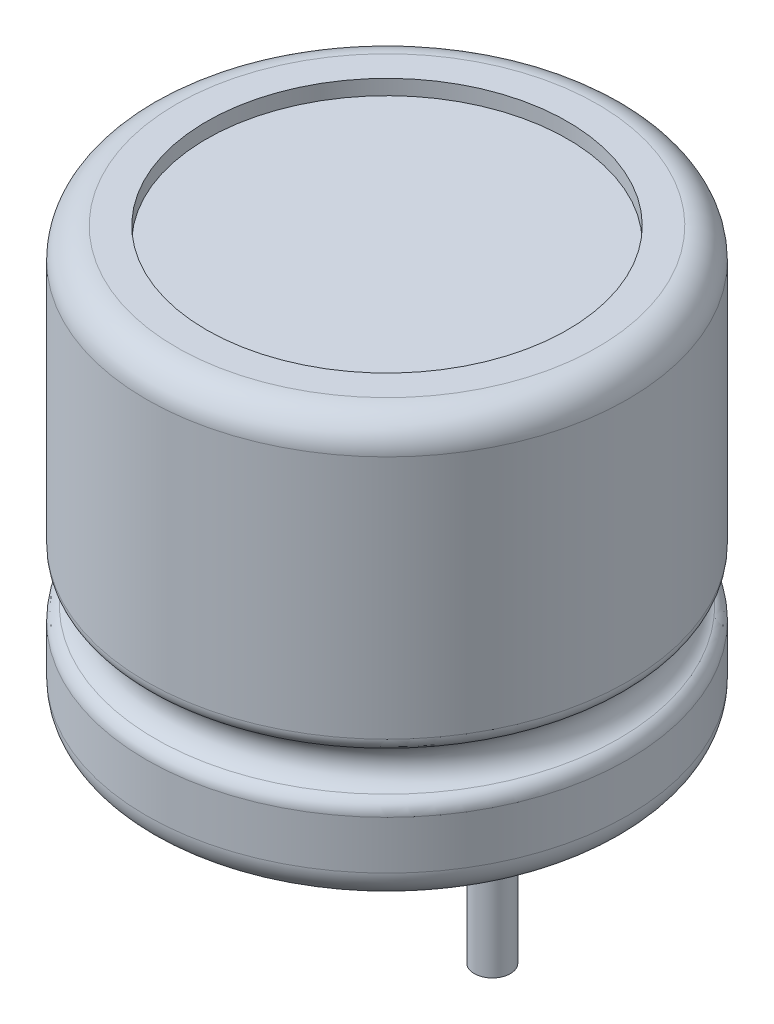
ISO-10303-21;
HEADER;
FILE_DESCRIPTION(('STEP AP214'),'2;1');
FILE_NAME('part.step','',(''),(''),'','','');
FILE_SCHEMA(('AUTOMOTIVE_DESIGN { 1 0 10303 214 1 1 1 1 }'));
ENDSEC;
DATA;
#1=APPLICATION_CONTEXT('core data for automotive mechanical design processes');
#2=APPLICATION_PROTOCOL_DEFINITION('international standard','automotive_design',2000,#1);
#3=PRODUCT_CONTEXT('',#1,'mechanical');
#4=PRODUCT('Part','Part','',(#3));
#5=PRODUCT_RELATED_PRODUCT_CATEGORY('part','',(#4));
#6=PRODUCT_DEFINITION_FORMATION('','',#4);
#7=PRODUCT_DEFINITION_CONTEXT('part definition',#1,'design');
#8=PRODUCT_DEFINITION('design','',#6,#7);
#9=PRODUCT_DEFINITION_SHAPE('','',#8);
#10=(LENGTH_UNIT() NAMED_UNIT(*) SI_UNIT(.MILLI.,.METRE.));
#11=(NAMED_UNIT(*) PLANE_ANGLE_UNIT() SI_UNIT($,.RADIAN.));
#12=(NAMED_UNIT(*) SI_UNIT($,.STERADIAN.) SOLID_ANGLE_UNIT());
#13=UNCERTAINTY_MEASURE_WITH_UNIT(LENGTH_MEASURE(1.E-05),#10,'distance_accuracy_value','');
#14=(GEOMETRIC_REPRESENTATION_CONTEXT(3) GLOBAL_UNCERTAINTY_ASSIGNED_CONTEXT((#13)) GLOBAL_UNIT_ASSIGNED_CONTEXT((#10,
#11,#12)) REPRESENTATION_CONTEXT('',''));
#15=CARTESIAN_POINT('',(0.,0.,0.));
#16=DIRECTION('',(0.,0.,1.));
#17=DIRECTION('',(1.,0.,0.));
#18=AXIS2_PLACEMENT_3D('',#15,#16,#17);
#19=CARTESIAN_POINT('',(0.,6.99057191956741,0.));
#20=DIRECTION('',(0.,-1.,0.));
#21=DIRECTION('',(1.,0.,0.));
#22=AXIS2_PLACEMENT_3D('',#19,#20,#21);
#23=CYLINDRICAL_SURFACE('',#22,4.);
#24=CARTESIAN_POINT('',(0.,6.49057191956741,0.));
#25=DIRECTION('',(0.,1.,0.));
#26=DIRECTION('',(-1.,0.,0.));
#27=AXIS2_PLACEMENT_3D('',#24,#25,#26);
#28=CIRCLE('',#27,4.);
#29=CARTESIAN_POINT('',(-4.,6.49057191956741,0.));
#30=VERTEX_POINT('',#29);
#31=EDGE_CURVE('E41',#30,#30,#28,.F.);
#32=ORIENTED_EDGE('',*,*,#31,.T.);
#33=EDGE_LOOP('',(#32));
#34=FACE_BOUND('',#33,.T.);
#35=CARTESIAN_POINT('',(0.,2.42749305001555,0.));
#36=DIRECTION('',(0.,1.,0.));
#37=DIRECTION('',(-1.,0.,0.));
#38=AXIS2_PLACEMENT_3D('',#35,#36,#37);
#39=CIRCLE('',#38,4.);
#40=CARTESIAN_POINT('',(-4.,2.42749305001555,0.));
#41=VERTEX_POINT('',#40);
#42=EDGE_CURVE('E57',#41,#41,#39,.T.);
#43=ORIENTED_EDGE('',*,*,#42,.T.);
#44=EDGE_LOOP('',(#43));
#45=FACE_BOUND('',#44,.T.);
#46=ADVANCED_FACE('F34',(#34,#45),#23,.T.);
#47=CARTESIAN_POINT('',(0.,1.86528595978371,0.));
#48=DIRECTION('',(0.,-1.,0.));
#49=DIRECTION('',(1.,0.,0.));
#50=AXIS2_PLACEMENT_3D('',#47,#48,#49);
#51=TOROIDAL_SURFACE('',#50,4.,0.365285959783707);
#52=CARTESIAN_POINT('',(0.,2.19905979825183,0.));
#53=DIRECTION('',(0.,-1.,0.));
#54=DIRECTION('',(1.,0.,0.));
#55=AXIS2_PLACEMENT_3D('',#52,#53,#54);
#56=CIRCLE('',#55,3.85157878463856);
#57=CARTESIAN_POINT('',(3.85157878463856,2.19905979825183,0.));
#58=VERTEX_POINT('',#57);
#59=EDGE_CURVE('E60',#58,#58,#56,.T.);
#60=ORIENTED_EDGE('',*,*,#59,.T.);
#61=EDGE_LOOP('',(#60));
#62=FACE_BOUND('',#61,.T.);
#63=CARTESIAN_POINT('',(0.,1.53151212131558,0.));
#64=DIRECTION('',(0.,1.,0.));
#65=DIRECTION('',(-1.,0.,0.));
#66=AXIS2_PLACEMENT_3D('',#63,#64,#65);
#67=CIRCLE('',#66,3.85157878463856);
#68=CARTESIAN_POINT('',(-3.85157878463856,1.53151212131558,0.));
#69=VERTEX_POINT('',#68);
#70=EDGE_CURVE('E63',#69,#69,#67,.T.);
#71=ORIENTED_EDGE('',*,*,#70,.T.);
#72=EDGE_LOOP('',(#71));
#73=FACE_BOUND('',#72,.T.);
#74=ADVANCED_FACE('F109',(#62,#73),#51,.F.);
#75=CARTESIAN_POINT('',(0.,6.99057191956741,0.));
#76=DIRECTION('',(0.,-1.,0.));
#77=DIRECTION('',(1.,0.,0.));
#78=AXIS2_PLACEMENT_3D('',#75,#76,#77);
#79=CYLINDRICAL_SURFACE('',#78,4.);
#80=CARTESIAN_POINT('',(0.,0.5,0.));
#81=DIRECTION('',(0.,-1.,0.));
#82=DIRECTION('',(1.,0.,0.));
#83=AXIS2_PLACEMENT_3D('',#80,#81,#82);
#84=CIRCLE('',#83,4.);
#85=CARTESIAN_POINT('',(4.,0.5,0.));
#86=VERTEX_POINT('',#85);
#87=EDGE_CURVE('E45',#86,#86,#84,.F.);
#88=ORIENTED_EDGE('',*,*,#87,.T.);
#89=EDGE_LOOP('',(#88));
#90=FACE_BOUND('',#89,.T.);
#91=CARTESIAN_POINT('',(0.,1.30307886955186,0.));
#92=DIRECTION('',(0.,1.,0.));
#93=DIRECTION('',(-1.,0.,0.));
#94=AXIS2_PLACEMENT_3D('',#91,#92,#93);
#95=CIRCLE('',#94,4.);
#96=CARTESIAN_POINT('',(-4.,1.30307886955186,0.));
#97=VERTEX_POINT('',#96);
#98=EDGE_CURVE('E54',#97,#97,#95,.F.);
#99=ORIENTED_EDGE('',*,*,#98,.T.);
#100=EDGE_LOOP('',(#99));
#101=FACE_BOUND('',#100,.T.);
#102=ADVANCED_FACE('F105',(#90,#101),#79,.T.);
#103=CARTESIAN_POINT('',(0.,0.,0.));
#104=DIRECTION('',(0.,-1.,0.));
#105=DIRECTION('',(1.,0.,0.));
#106=AXIS2_PLACEMENT_3D('',#103,#104,#105);
#107=PLANE('',#106);
#108=CARTESIAN_POINT('',(0.,0.,0.));
#109=DIRECTION('',(0.,-1.,0.));
#110=DIRECTION('',(1.,0.,0.));
#111=AXIS2_PLACEMENT_3D('',#108,#109,#110);
#112=CIRCLE('',#111,3.5);
#113=CARTESIAN_POINT('',(3.5,0.,0.));
#114=VERTEX_POINT('',#113);
#115=EDGE_CURVE('E49',#114,#114,#112,.T.);
#116=ORIENTED_EDGE('',*,*,#115,.T.);
#117=EDGE_LOOP('',(#116));
#118=FACE_BOUND('',#117,.T.);
#119=CARTESIAN_POINT('',(0.,0.,0.));
#120=DIRECTION('',(0.,-1.,0.));
#121=DIRECTION('',(0.,0.,-1.));
#122=AXIS2_PLACEMENT_3D('',#119,#120,#121);
#123=CIRCLE('',#122,2.99999999999999);
#124=CARTESIAN_POINT('',(0.,0.,-2.99999999999999));
#125=VERTEX_POINT('',#124);
#126=EDGE_CURVE('E69',#125,#125,#123,.T.);
#127=ORIENTED_EDGE('',*,*,#126,.F.);
#128=EDGE_LOOP('',(#127));
#129=FACE_BOUND('',#128,.T.);
#130=ADVANCED_FACE('F96',(#118,#129),#107,.T.);
#131=CARTESIAN_POINT('',(4.,6.99057191956741,0.));
#132=DIRECTION('',(0.,1.,0.));
#133=DIRECTION('',(-1.,0.,0.));
#134=AXIS2_PLACEMENT_3D('',#131,#132,#133);
#135=PLANE('',#134);
#136=CARTESIAN_POINT('',(0.,6.99057191956741,0.));
#137=DIRECTION('',(0.,1.,0.));
#138=DIRECTION('',(-1.,0.,0.));
#139=AXIS2_PLACEMENT_3D('',#136,#137,#138);
#140=CIRCLE('',#139,3.5);
#141=CARTESIAN_POINT('',(-3.5,6.99057191956741,0.));
#142=VERTEX_POINT('',#141);
#143=EDGE_CURVE('E11',#142,#142,#140,.T.);
#144=ORIENTED_EDGE('',*,*,#143,.T.);
#145=EDGE_LOOP('',(#144));
#146=FACE_BOUND('',#145,.T.);
#147=CARTESIAN_POINT('',(0.,6.99057191956741,0.));
#148=DIRECTION('',(0.,1.,0.));
#149=DIRECTION('',(0.,0.,1.));
#150=AXIS2_PLACEMENT_3D('',#147,#148,#149);
#151=CIRCLE('',#150,2.99999999999999);
#152=CARTESIAN_POINT('',(0.,6.99057191956741,2.99999999999999));
#153=VERTEX_POINT('',#152);
#154=EDGE_CURVE('E87',#153,#153,#151,.T.);
#155=ORIENTED_EDGE('',*,*,#154,.F.);
#156=EDGE_LOOP('',(#155));
#157=FACE_BOUND('',#156,.T.);
#158=ADVANCED_FACE('F93',(#146,#157),#135,.T.);
#159=CARTESIAN_POINT('',(0.,0.249999999999995,0.));
#160=DIRECTION('',(0.,1.,0.));
#161=DIRECTION('',(0.,0.,1.));
#162=AXIS2_PLACEMENT_3D('',#159,#160,#161);
#163=PLANE('',#162);
#164=CARTESIAN_POINT('',(-1.75,0.25,0.));
#165=DIRECTION('',(0.,1.,0.));
#166=DIRECTION('',(0.,0.,1.));
#167=AXIS2_PLACEMENT_3D('',#164,#165,#166);
#168=CIRCLE('',#167,0.3);
#169=CARTESIAN_POINT('',(-1.75,0.25,0.3));
#170=VERTEX_POINT('',#169);
#171=EDGE_CURVE('E81',#170,#170,#168,.T.);
#172=ORIENTED_EDGE('',*,*,#171,.T.);
#173=EDGE_LOOP('',(#172));
#174=FACE_BOUND('',#173,.T.);
#175=CARTESIAN_POINT('',(1.75,0.25,0.));
#176=DIRECTION('',(0.,1.,0.));
#177=DIRECTION('',(0.,0.,1.));
#178=AXIS2_PLACEMENT_3D('',#175,#176,#177);
#179=CIRCLE('',#178,0.3);
#180=CARTESIAN_POINT('',(1.75,0.25,0.3));
#181=VERTEX_POINT('',#180);
#182=EDGE_CURVE('E72',#181,#181,#179,.T.);
#183=ORIENTED_EDGE('',*,*,#182,.T.);
#184=EDGE_LOOP('',(#183));
#185=FACE_BOUND('',#184,.T.);
#186=CARTESIAN_POINT('',(0.,0.25,0.));
#187=DIRECTION('',(0.,-1.,0.));
#188=DIRECTION('',(0.,0.,-1.));
#189=AXIS2_PLACEMENT_3D('',#186,#187,#188);
#190=CIRCLE('',#189,2.99999999999999);
#191=CARTESIAN_POINT('',(0.,0.25,-2.99999999999999));
#192=VERTEX_POINT('',#191);
#193=EDGE_CURVE('E66',#192,#192,#190,.T.);
#194=ORIENTED_EDGE('',*,*,#193,.T.);
#195=EDGE_LOOP('',(#194));
#196=FACE_BOUND('',#195,.T.);
#197=ADVANCED_FACE('F95',(#174,#185,#196),#163,.F.);
#198=CARTESIAN_POINT('',(0.,0.,0.));
#199=DIRECTION('',(0.,-1.,0.));
#200=DIRECTION('',(0.,0.,-1.));
#201=AXIS2_PLACEMENT_3D('',#198,#199,#200);
#202=CYLINDRICAL_SURFACE('',#201,2.99999999999999);
#203=ORIENTED_EDGE('',*,*,#193,.F.);
#204=EDGE_LOOP('',(#203));
#205=FACE_BOUND('',#204,.T.);
#206=ORIENTED_EDGE('',*,*,#126,.T.);
#207=EDGE_LOOP('',(#206));
#208=FACE_BOUND('',#207,.T.);
#209=ADVANCED_FACE('F102',(#205,#208),#202,.F.);
#210=CARTESIAN_POINT('',(1.75,-2.75,0.));
#211=DIRECTION('',(0.,1.,0.));
#212=DIRECTION('',(0.,0.,1.));
#213=AXIS2_PLACEMENT_3D('',#210,#211,#212);
#214=CYLINDRICAL_SURFACE('',#213,0.3);
#215=CARTESIAN_POINT('',(1.75,-2.75,0.));
#216=DIRECTION('',(0.,1.,0.));
#217=DIRECTION('',(0.,0.,1.));
#218=AXIS2_PLACEMENT_3D('',#215,#216,#217);
#219=CIRCLE('',#218,0.3);
#220=CARTESIAN_POINT('',(1.75,-2.75,0.3));
#221=VERTEX_POINT('',#220);
#222=EDGE_CURVE('E75',#221,#221,#219,.T.);
#223=ORIENTED_EDGE('',*,*,#222,.T.);
#224=EDGE_LOOP('',(#223));
#225=FACE_BOUND('',#224,.T.);
#226=ORIENTED_EDGE('',*,*,#182,.F.);
#227=EDGE_LOOP('',(#226));
#228=FACE_BOUND('',#227,.T.);
#229=ADVANCED_FACE('F140',(#225,#228),#214,.T.);
#230=CARTESIAN_POINT('',(1.75,-2.75,0.));
#231=DIRECTION('',(0.,-1.,0.));
#232=DIRECTION('',(0.,0.,-1.));
#233=AXIS2_PLACEMENT_3D('',#230,#231,#232);
#234=PLANE('',#233);
#235=ORIENTED_EDGE('',*,*,#222,.F.);
#236=EDGE_LOOP('',(#235));
#237=FACE_BOUND('',#236,.T.);
#238=ADVANCED_FACE('F146',(#237),#234,.T.);
#239=CARTESIAN_POINT('',(-1.75,-1.75,0.));
#240=DIRECTION('',(0.,1.,0.));
#241=DIRECTION('',(0.,0.,1.));
#242=AXIS2_PLACEMENT_3D('',#239,#240,#241);
#243=CYLINDRICAL_SURFACE('',#242,0.3);
#244=CARTESIAN_POINT('',(-1.75,-1.75,0.));
#245=DIRECTION('',(0.,1.,0.));
#246=DIRECTION('',(0.,0.,1.));
#247=AXIS2_PLACEMENT_3D('',#244,#245,#246);
#248=CIRCLE('',#247,0.3);
#249=CARTESIAN_POINT('',(-1.75,-1.75,0.3));
#250=VERTEX_POINT('',#249);
#251=EDGE_CURVE('E78',#250,#250,#248,.T.);
#252=ORIENTED_EDGE('',*,*,#251,.T.);
#253=EDGE_LOOP('',(#252));
#254=FACE_BOUND('',#253,.T.);
#255=ORIENTED_EDGE('',*,*,#171,.F.);
#256=EDGE_LOOP('',(#255));
#257=FACE_BOUND('',#256,.T.);
#258=ADVANCED_FACE('F153',(#254,#257),#243,.T.);
#259=CARTESIAN_POINT('',(-1.45,-1.75,0.));
#260=DIRECTION('',(0.,-1.,0.));
#261=DIRECTION('',(0.,0.,-1.));
#262=AXIS2_PLACEMENT_3D('',#259,#260,#261);
#263=PLANE('',#262);
#264=ORIENTED_EDGE('',*,*,#251,.F.);
#265=EDGE_LOOP('',(#264));
#266=FACE_BOUND('',#265,.T.);
#267=ADVANCED_FACE('F157',(#266),#263,.T.);
#268=CARTESIAN_POINT('',(0.,6.74057191956742,0.));
#269=DIRECTION('',(0.,-1.,0.));
#270=DIRECTION('',(0.,0.,-1.));
#271=AXIS2_PLACEMENT_3D('',#268,#269,#270);
#272=PLANE('',#271);
#273=CARTESIAN_POINT('',(0.,6.74057191956741,0.));
#274=DIRECTION('',(0.,1.,0.));
#275=DIRECTION('',(0.,0.,1.));
#276=AXIS2_PLACEMENT_3D('',#273,#274,#275);
#277=CIRCLE('',#276,2.99999999999999);
#278=CARTESIAN_POINT('',(0.,6.74057191956741,2.99999999999999));
#279=VERTEX_POINT('',#278);
#280=EDGE_CURVE('E84',#279,#279,#277,.T.);
#281=ORIENTED_EDGE('',*,*,#280,.T.);
#282=EDGE_LOOP('',(#281));
#283=FACE_BOUND('',#282,.T.);
#284=ADVANCED_FACE('F161',(#283),#272,.F.);
#285=CARTESIAN_POINT('',(0.,6.99057191956741,0.));
#286=DIRECTION('',(0.,1.,0.));
#287=DIRECTION('',(0.,0.,1.));
#288=AXIS2_PLACEMENT_3D('',#285,#286,#287);
#289=CYLINDRICAL_SURFACE('',#288,2.99999999999999);
#290=ORIENTED_EDGE('',*,*,#280,.F.);
#291=EDGE_LOOP('',(#290));
#292=FACE_BOUND('',#291,.T.);
#293=ORIENTED_EDGE('',*,*,#154,.T.);
#294=EDGE_LOOP('',(#293));
#295=FACE_BOUND('',#294,.T.);
#296=ADVANCED_FACE('F91',(#292,#295),#289,.F.);
#297=CARTESIAN_POINT('',(0.,2.42749305001555,0.));
#298=DIRECTION('',(0.,1.,0.));
#299=DIRECTION('',(-1.,0.,0.));
#300=AXIS2_PLACEMENT_3D('',#297,#298,#299);
#301=TOROIDAL_SURFACE('',#300,3.75,0.25);
#302=ORIENTED_EDGE('',*,*,#42,.F.);
#303=EDGE_LOOP('',(#302));
#304=FACE_BOUND('',#303,.T.);
#305=ORIENTED_EDGE('',*,*,#59,.F.);
#306=EDGE_LOOP('',(#305));
#307=FACE_BOUND('',#306,.T.);
#308=ADVANCED_FACE('F119',(#304,#307),#301,.T.);
#309=CARTESIAN_POINT('',(0.,1.30307886955186,0.));
#310=DIRECTION('',(0.,1.,0.));
#311=DIRECTION('',(-1.,0.,0.));
#312=AXIS2_PLACEMENT_3D('',#309,#310,#311);
#313=TOROIDAL_SURFACE('',#312,3.75,0.25);
#314=ORIENTED_EDGE('',*,*,#70,.F.);
#315=EDGE_LOOP('',(#314));
#316=FACE_BOUND('',#315,.T.);
#317=ORIENTED_EDGE('',*,*,#98,.F.);
#318=EDGE_LOOP('',(#317));
#319=FACE_BOUND('',#318,.T.);
#320=ADVANCED_FACE('F122',(#316,#319),#313,.T.);
#321=CARTESIAN_POINT('',(0.,0.5,0.));
#322=DIRECTION('',(0.,-1.,0.));
#323=DIRECTION('',(1.,0.,0.));
#324=AXIS2_PLACEMENT_3D('',#321,#322,#323);
#325=TOROIDAL_SURFACE('',#324,3.5,0.5);
#326=ORIENTED_EDGE('',*,*,#87,.F.);
#327=EDGE_LOOP('',(#326));
#328=FACE_BOUND('',#327,.T.);
#329=ORIENTED_EDGE('',*,*,#115,.F.);
#330=EDGE_LOOP('',(#329));
#331=FACE_BOUND('',#330,.T.);
#332=ADVANCED_FACE('F125',(#328,#331),#325,.T.);
#333=CARTESIAN_POINT('',(0.,6.49057191956741,0.));
#334=DIRECTION('',(0.,1.,0.));
#335=DIRECTION('',(-1.,0.,0.));
#336=AXIS2_PLACEMENT_3D('',#333,#334,#335);
#337=TOROIDAL_SURFACE('',#336,3.5,0.5);
#338=ORIENTED_EDGE('',*,*,#143,.F.);
#339=EDGE_LOOP('',(#338));
#340=FACE_BOUND('',#339,.T.);
#341=ORIENTED_EDGE('',*,*,#31,.F.);
#342=EDGE_LOOP('',(#341));
#343=FACE_BOUND('',#342,.T.);
#344=ADVANCED_FACE('F36',(#340,#343),#337,.T.);
#345=CLOSED_SHELL('',(#46,#74,#102,#130,#158,#197,#209,#229,#238,#258,#267,#284,#296,#308,#320,
#332,#344));
#346=MANIFOLD_SOLID_BREP('B2',#345);
#347=ADVANCED_BREP_SHAPE_REPRESENTATION('',(#18,#346),#14);
#348=SHAPE_DEFINITION_REPRESENTATION(#9,#347);
ENDSEC;
END-ISO-10303-21;
